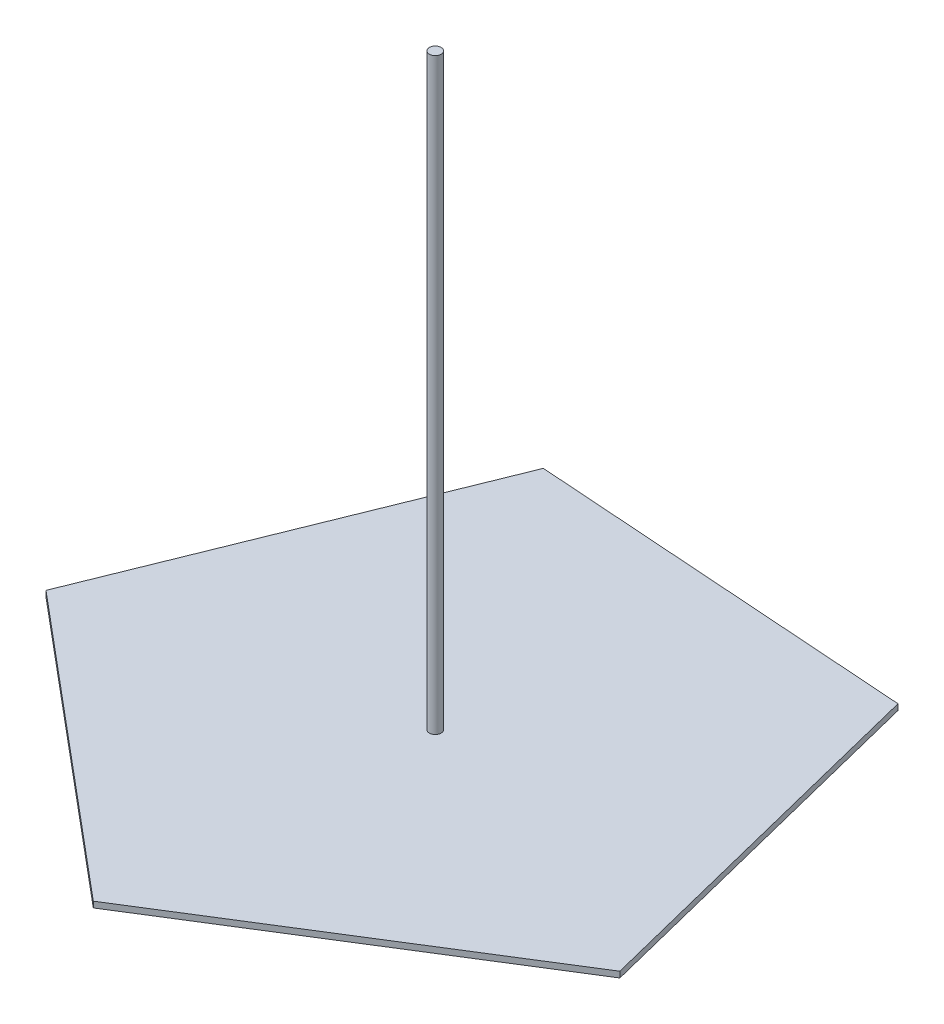
ISO-10303-21;
HEADER;
FILE_DESCRIPTION(('STEP AP214'),'2;1');
FILE_NAME('part.step','',(''),(''),'','','');
FILE_SCHEMA(('AUTOMOTIVE_DESIGN { 1 0 10303 214 1 1 1 1 }'));
ENDSEC;
DATA;
#1=APPLICATION_CONTEXT('core data for automotive mechanical design processes');
#2=APPLICATION_PROTOCOL_DEFINITION('international standard','automotive_design',2000,#1);
#3=PRODUCT_CONTEXT('',#1,'mechanical');
#4=PRODUCT('Part','Part','',(#3));
#5=PRODUCT_RELATED_PRODUCT_CATEGORY('part','',(#4));
#6=PRODUCT_DEFINITION_FORMATION('','',#4);
#7=PRODUCT_DEFINITION_CONTEXT('part definition',#1,'design');
#8=PRODUCT_DEFINITION('design','',#6,#7);
#9=PRODUCT_DEFINITION_SHAPE('','',#8);
#10=(LENGTH_UNIT() NAMED_UNIT(*) SI_UNIT(.MILLI.,.METRE.));
#11=(NAMED_UNIT(*) PLANE_ANGLE_UNIT() SI_UNIT($,.RADIAN.));
#12=(NAMED_UNIT(*) SI_UNIT($,.STERADIAN.) SOLID_ANGLE_UNIT());
#13=UNCERTAINTY_MEASURE_WITH_UNIT(LENGTH_MEASURE(1.E-05),#10,'distance_accuracy_value','');
#14=(GEOMETRIC_REPRESENTATION_CONTEXT(3) GLOBAL_UNCERTAINTY_ASSIGNED_CONTEXT((#13)) GLOBAL_UNIT_ASSIGNED_CONTEXT((#10,
#11,#12)) REPRESENTATION_CONTEXT('',''));
#15=CARTESIAN_POINT('',(0.,0.,0.));
#16=DIRECTION('',(0.,0.,1.));
#17=DIRECTION('',(1.,0.,0.));
#18=AXIS2_PLACEMENT_3D('',#15,#16,#17);
#19=CARTESIAN_POINT('',(130.203487993365,2.54,52.5489016042315));
#20=DIRECTION('',(-0.970205042532263,0.,0.24228531826128));
#21=DIRECTION('',(0.24228531826128,0.,0.970205042532263));
#22=AXIS2_PLACEMENT_3D('',#19,#20,#21);
#23=PLANE('',#22);
#24=DIRECTION('',(-0.24228531826128,0.,-0.970205042532263));
#25=VECTOR('',#24,1.);
#26=CARTESIAN_POINT('',(130.203487993365,0.,52.5489016042315));
#27=LINE('',#26,#25);
#28=CARTESIAN_POINT('',(130.203487993365,0.,52.5489016042315));
#29=VERTEX_POINT('',#28);
#30=CARTESIAN_POINT('',(90.2120658117013,0.,-107.592372069003));
#31=VERTEX_POINT('',#30);
#32=EDGE_CURVE('E107',#29,#31,#27,.T.);
#33=ORIENTED_EDGE('',*,*,#32,.T.);
#34=DIRECTION('',(0.,-1.,0.));
#35=VECTOR('',#34,1.);
#36=CARTESIAN_POINT('',(90.2120658117013,2.54,-107.592372069003));
#37=LINE('',#36,#35);
#38=CARTESIAN_POINT('',(90.2120658117013,2.54,-107.592372069003));
#39=VERTEX_POINT('',#38);
#40=EDGE_CURVE('E11',#39,#31,#37,.T.);
#41=ORIENTED_EDGE('',*,*,#40,.F.);
#42=DIRECTION('',(-0.24228531826128,0.,-0.970205042532263));
#43=VECTOR('',#42,1.);
#44=CARTESIAN_POINT('',(130.203487993365,2.54,52.5489016042315));
#45=LINE('',#44,#43);
#46=CARTESIAN_POINT('',(130.203487993365,2.54,52.5489016042315));
#47=VERTEX_POINT('',#46);
#48=EDGE_CURVE('E116',#47,#39,#45,.T.);
#49=ORIENTED_EDGE('',*,*,#48,.F.);
#50=DIRECTION('',(0.,-1.,0.));
#51=VECTOR('',#50,1.);
#52=CARTESIAN_POINT('',(130.203487993365,2.54,52.5489016042315));
#53=LINE('',#52,#51);
#54=EDGE_CURVE('E103',#47,#29,#53,.T.);
#55=ORIENTED_EDGE('',*,*,#54,.T.);
#56=EDGE_LOOP('',(#33,#41,#49,#55));
#57=FACE_BOUND('',#56,.T.);
#58=ADVANCED_FACE('F33',(#57),#23,.F.);
#59=CARTESIAN_POINT('',(90.2120658117013,2.54,-107.592372069003));
#60=DIRECTION('',(-0.0693828154357029,0.,0.997590108673004));
#61=DIRECTION('',(0.997590108673004,0.,0.0693828154357029));
#62=AXIS2_PLACEMENT_3D('',#59,#60,#61);
#63=PLANE('',#62);
#64=DIRECTION('',(-0.997590108673004,0.,-0.0693828154357029));
#65=VECTOR('',#64,1.);
#66=CARTESIAN_POINT('',(90.2120658117013,0.,-107.592372069003));
#67=LINE('',#66,#65);
#68=CARTESIAN_POINT('',(-74.4493651263907,0.,-119.0446444731));
#69=VERTEX_POINT('',#68);
#70=EDGE_CURVE('E110',#31,#69,#67,.T.);
#71=ORIENTED_EDGE('',*,*,#70,.T.);
#72=DIRECTION('',(0.,-1.,0.));
#73=VECTOR('',#72,1.);
#74=CARTESIAN_POINT('',(-74.4493651263907,2.54,-119.0446444731));
#75=LINE('',#74,#73);
#76=CARTESIAN_POINT('',(-74.4493651263907,2.54,-119.0446444731));
#77=VERTEX_POINT('',#76);
#78=EDGE_CURVE('E41',#77,#69,#75,.T.);
#79=ORIENTED_EDGE('',*,*,#78,.F.);
#80=DIRECTION('',(-0.997590108673004,0.,-0.0693828154357029));
#81=VECTOR('',#80,1.);
#82=CARTESIAN_POINT('',(90.2120658117013,2.54,-107.592372069003));
#83=LINE('',#82,#81);
#84=EDGE_CURVE('E83',#39,#77,#83,.T.);
#85=ORIENTED_EDGE('',*,*,#84,.F.);
#86=ORIENTED_EDGE('',*,*,#40,.T.);
#87=EDGE_LOOP('',(#71,#79,#85,#86));
#88=FACE_BOUND('',#87,.T.);
#89=ADVANCED_FACE('F136',(#88),#63,.F.);
#90=CARTESIAN_POINT('',(-74.4493651263907,2.54,-119.0446444731));
#91=DIRECTION('',(0.927324104357838,0.,0.374259275739338));
#92=DIRECTION('',(0.374259275739338,0.,-0.927324104357838));
#93=AXIS2_PLACEMENT_3D('',#90,#91,#92);
#94=PLANE('',#93);
#95=DIRECTION('',(-0.374259275739338,0.,0.927324104357838));
#96=VECTOR('',#95,1.);
#97=CARTESIAN_POINT('',(-74.4493651263907,0.,-119.0446444731));
#98=LINE('',#97,#96);
#99=CARTESIAN_POINT('',(-136.224303900662,0.,34.0187356059795));
#100=VERTEX_POINT('',#99);
#101=EDGE_CURVE('E98',#69,#100,#98,.T.);
#102=ORIENTED_EDGE('',*,*,#101,.T.);
#103=DIRECTION('',(0.,-1.,0.));
#104=VECTOR('',#103,1.);
#105=CARTESIAN_POINT('',(-136.224303900662,2.54,34.0187356059795));
#106=LINE('',#105,#104);
#107=CARTESIAN_POINT('',(-136.224303900662,2.54,34.0187356059795));
#108=VERTEX_POINT('',#107);
#109=EDGE_CURVE('E95',#108,#100,#106,.T.);
#110=ORIENTED_EDGE('',*,*,#109,.F.);
#111=DIRECTION('',(-0.374259275739338,0.,0.927324104357838));
#112=VECTOR('',#111,1.);
#113=CARTESIAN_POINT('',(-74.4493651263907,2.54,-119.0446444731));
#114=LINE('',#113,#112);
#115=EDGE_CURVE('E87',#77,#108,#114,.T.);
#116=ORIENTED_EDGE('',*,*,#115,.F.);
#117=ORIENTED_EDGE('',*,*,#78,.T.);
#118=EDGE_LOOP('',(#102,#110,#116,#117));
#119=FACE_BOUND('',#118,.T.);
#120=ADVANCED_FACE('F96',(#119),#94,.F.);
#121=CARTESIAN_POINT('',(-136.224303900662,2.54,34.0187356059795));
#122=DIRECTION('',(0.642500630515901,0.,-0.766285155661174));
#123=DIRECTION('',(-0.766285155661174,0.,-0.642500630515901));
#124=AXIS2_PLACEMENT_3D('',#121,#122,#123);
#125=PLANE('',#124);
#126=DIRECTION('',(0.766285155661174,0.,0.642500630515901));
#127=VECTOR('',#126,1.);
#128=CARTESIAN_POINT('',(-136.224303900662,0.,34.0187356059795));
#129=LINE('',#128,#127);
#130=CARTESIAN_POINT('',(-9.74188477801319,0.,140.069379331892));
#131=VERTEX_POINT('',#130);
#132=EDGE_CURVE('E69',#100,#131,#129,.T.);
#133=ORIENTED_EDGE('',*,*,#132,.T.);
#134=DIRECTION('',(0.,-1.,0.));
#135=VECTOR('',#134,1.);
#136=CARTESIAN_POINT('',(-9.74188477801319,2.54,140.069379331892));
#137=LINE('',#136,#135);
#138=CARTESIAN_POINT('',(-9.74188477801319,2.54,140.069379331892));
#139=VERTEX_POINT('',#138);
#140=EDGE_CURVE('E99',#139,#131,#137,.T.);
#141=ORIENTED_EDGE('',*,*,#140,.F.);
#142=DIRECTION('',(0.766285155661174,0.,0.642500630515901));
#143=VECTOR('',#142,1.);
#144=CARTESIAN_POINT('',(-136.224303900662,2.54,34.0187356059795));
#145=LINE('',#144,#143);
#146=EDGE_CURVE('E91',#108,#139,#145,.T.);
#147=ORIENTED_EDGE('',*,*,#146,.F.);
#148=ORIENTED_EDGE('',*,*,#109,.T.);
#149=EDGE_LOOP('',(#133,#141,#147,#148));
#150=FACE_BOUND('',#149,.T.);
#151=ADVANCED_FACE('F101',(#150),#125,.F.);
#152=CARTESIAN_POINT('',(-9.74188477801319,2.54,140.069379331892));
#153=DIRECTION('',(-0.530236876905773,0.,-0.847849547012447));
#154=DIRECTION('',(-0.847849547012447,0.,0.530236876905773));
#155=AXIS2_PLACEMENT_3D('',#152,#153,#154);
#156=PLANE('',#155);
#157=DIRECTION('',(0.847849547012447,0.,-0.530236876905773));
#158=VECTOR('',#157,1.);
#159=CARTESIAN_POINT('',(-9.74188477801319,0.,140.069379331892));
#160=LINE('',#159,#158);
#161=EDGE_CURVE('E75',#131,#29,#160,.T.);
#162=ORIENTED_EDGE('',*,*,#161,.T.);
#163=ORIENTED_EDGE('',*,*,#54,.F.);
#164=DIRECTION('',(0.847849547012447,0.,-0.530236876905773));
#165=VECTOR('',#164,1.);
#166=CARTESIAN_POINT('',(-9.74188477801319,2.54,140.069379331892));
#167=LINE('',#166,#165);
#168=EDGE_CURVE('E49',#139,#47,#167,.T.);
#169=ORIENTED_EDGE('',*,*,#168,.F.);
#170=ORIENTED_EDGE('',*,*,#140,.T.);
#171=EDGE_LOOP('',(#162,#163,#169,#170));
#172=FACE_BOUND('',#171,.T.);
#173=ADVANCED_FACE('F124',(#172),#156,.F.);
#174=CARTESIAN_POINT('',(0.,2.54,0.));
#175=DIRECTION('',(0.,1.,0.));
#176=DIRECTION('',(0.,0.,1.));
#177=AXIS2_PLACEMENT_3D('',#174,#175,#176);
#178=PLANE('',#177);
#179=CARTESIAN_POINT('',(0.,2.54,2.07952935363664));
#180=DIRECTION('',(0.,1.,0.));
#181=DIRECTION('',(0.,0.,1.));
#182=AXIS2_PLACEMENT_3D('',#179,#180,#181);
#183=CIRCLE('',#182,2.54);
#184=CARTESIAN_POINT('',(0.,2.54,4.61952935363665));
#185=VERTEX_POINT('',#184);
#186=EDGE_CURVE('E193',#185,#185,#183,.T.);
#187=ORIENTED_EDGE('',*,*,#186,.F.);
#188=EDGE_LOOP('',(#187));
#189=FACE_BOUND('',#188,.T.);
#190=ORIENTED_EDGE('',*,*,#48,.T.);
#191=ORIENTED_EDGE('',*,*,#84,.T.);
#192=ORIENTED_EDGE('',*,*,#115,.T.);
#193=ORIENTED_EDGE('',*,*,#146,.T.);
#194=ORIENTED_EDGE('',*,*,#168,.T.);
#195=EDGE_LOOP('',(#190,#191,#192,#193,#194));
#196=FACE_BOUND('',#195,.T.);
#197=ADVANCED_FACE('F89',(#189,#196),#178,.T.);
#198=CARTESIAN_POINT('',(0.,0.,0.));
#199=DIRECTION('',(0.,1.,0.));
#200=DIRECTION('',(0.,0.,1.));
#201=AXIS2_PLACEMENT_3D('',#198,#199,#200);
#202=PLANE('',#201);
#203=ORIENTED_EDGE('',*,*,#32,.F.);
#204=ORIENTED_EDGE('',*,*,#161,.F.);
#205=ORIENTED_EDGE('',*,*,#132,.F.);
#206=ORIENTED_EDGE('',*,*,#101,.F.);
#207=ORIENTED_EDGE('',*,*,#70,.F.);
#208=EDGE_LOOP('',(#203,#204,#205,#206,#207));
#209=FACE_BOUND('',#208,.T.);
#210=ADVANCED_FACE('F120',(#209),#202,.F.);
#211=CARTESIAN_POINT('',(0.,256.54,2.07952935363664));
#212=DIRECTION('',(0.,-1.,0.));
#213=DIRECTION('',(0.,0.,-1.));
#214=AXIS2_PLACEMENT_3D('',#211,#212,#213);
#215=CYLINDRICAL_SURFACE('',#214,2.54);
#216=CARTESIAN_POINT('',(0.,256.54,2.07952935363664));
#217=DIRECTION('',(0.,1.,0.));
#218=DIRECTION('',(0.,0.,1.));
#219=AXIS2_PLACEMENT_3D('',#216,#217,#218);
#220=CIRCLE('',#219,2.54);
#221=CARTESIAN_POINT('',(0.,256.54,4.61952935363665));
#222=VERTEX_POINT('',#221);
#223=EDGE_CURVE('E111',#222,#222,#220,.T.);
#224=ORIENTED_EDGE('',*,*,#223,.F.);
#225=EDGE_LOOP('',(#224));
#226=FACE_BOUND('',#225,.T.);
#227=ORIENTED_EDGE('',*,*,#186,.T.);
#228=EDGE_LOOP('',(#227));
#229=FACE_BOUND('',#228,.T.);
#230=ADVANCED_FACE('F164',(#226,#229),#215,.T.);
#231=CARTESIAN_POINT('',(0.,256.54,2.07952935363664));
#232=DIRECTION('',(0.,1.,0.));
#233=DIRECTION('',(0.,0.,1.));
#234=AXIS2_PLACEMENT_3D('',#231,#232,#233);
#235=PLANE('',#234);
#236=ORIENTED_EDGE('',*,*,#223,.T.);
#237=EDGE_LOOP('',(#236));
#238=FACE_BOUND('',#237,.T.);
#239=ADVANCED_FACE('F177',(#238),#235,.T.);
#240=CLOSED_SHELL('',(#58,#89,#120,#151,#173,#197,#210,#230,#239));
#241=MANIFOLD_SOLID_BREP('B2',#240);
#242=ADVANCED_BREP_SHAPE_REPRESENTATION('',(#18,#241),#14);
#243=SHAPE_DEFINITION_REPRESENTATION(#9,#242);
ENDSEC;
END-ISO-10303-21;
